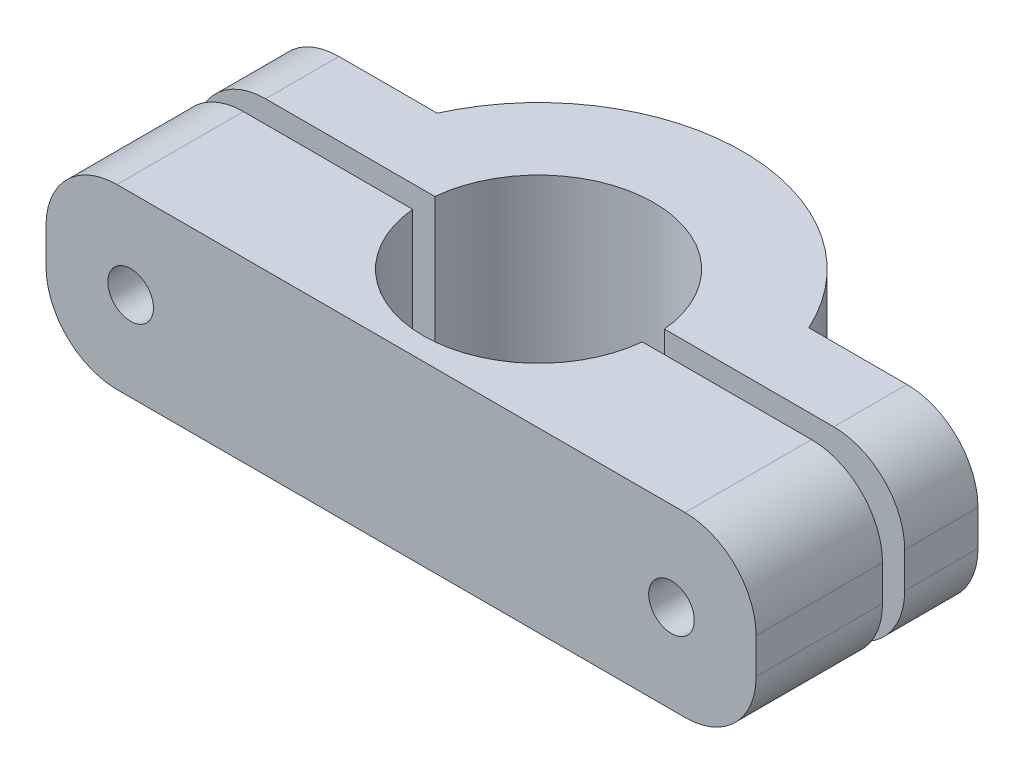
ISO-10303-21;
HEADER;
FILE_DESCRIPTION(('STEP AP214'),'2;1');
FILE_NAME('part.step','',(''),(''),'','','');
FILE_SCHEMA(('AUTOMOTIVE_DESIGN { 1 0 10303 214 1 1 1 1 }'));
ENDSEC;
DATA;
#1=APPLICATION_CONTEXT('core data for automotive mechanical design processes');
#2=APPLICATION_PROTOCOL_DEFINITION('international standard','automotive_design',2000,#1);
#3=PRODUCT_CONTEXT('',#1,'mechanical');
#4=PRODUCT('Part','Part','',(#3));
#5=PRODUCT_RELATED_PRODUCT_CATEGORY('part','',(#4));
#6=PRODUCT_DEFINITION_FORMATION('','',#4);
#7=PRODUCT_DEFINITION_CONTEXT('part definition',#1,'design');
#8=PRODUCT_DEFINITION('design','',#6,#7);
#9=PRODUCT_DEFINITION_SHAPE('','',#8);
#10=(LENGTH_UNIT() NAMED_UNIT(*) SI_UNIT(.MILLI.,.METRE.));
#11=(NAMED_UNIT(*) PLANE_ANGLE_UNIT() SI_UNIT($,.RADIAN.));
#12=(NAMED_UNIT(*) SI_UNIT($,.STERADIAN.) SOLID_ANGLE_UNIT());
#13=UNCERTAINTY_MEASURE_WITH_UNIT(LENGTH_MEASURE(1.E-05),#10,'distance_accuracy_value','');
#14=(GEOMETRIC_REPRESENTATION_CONTEXT(3) GLOBAL_UNCERTAINTY_ASSIGNED_CONTEXT((#13)) GLOBAL_UNIT_ASSIGNED_CONTEXT((#10,
#11,#12)) REPRESENTATION_CONTEXT('',''));
#15=CARTESIAN_POINT('',(0.,0.,0.));
#16=DIRECTION('',(0.,0.,1.));
#17=DIRECTION('',(1.,0.,0.));
#18=AXIS2_PLACEMENT_3D('',#15,#16,#17);
#19=CARTESIAN_POINT('',(0.,0.,-0.79375));
#20=DIRECTION('',(0.,0.,1.));
#21=DIRECTION('',(1.,0.,0.));
#22=AXIS2_PLACEMENT_3D('',#19,#20,#21);
#23=PLANE('',#22);
#24=CARTESIAN_POINT('',(-19.3465892333963,6.35,-0.793749999999999));
#25=DIRECTION('',(0.,0.,1.));
#26=DIRECTION('',(1.,0.,0.));
#27=AXIS2_PLACEMENT_3D('',#24,#25,#26);
#28=CIRCLE('',#27,1.63195);
#29=CARTESIAN_POINT('',(-17.7146392333963,6.35,-0.793749999999999));
#30=VERTEX_POINT('',#29);
#31=EDGE_CURVE('E196',#30,#30,#28,.F.);
#32=ORIENTED_EDGE('',*,*,#31,.T.);
#33=EDGE_LOOP('',(#32));
#34=FACE_BOUND('',#33,.T.);
#35=CARTESIAN_POINT('',(-20.32,5.08,-0.793749999999999));
#36=DIRECTION('',(0.,0.,1.));
#37=DIRECTION('',(1.,0.,0.));
#38=AXIS2_PLACEMENT_3D('',#35,#36,#37);
#39=CIRCLE('',#38,5.08);
#40=CARTESIAN_POINT('',(-20.32,0.,-0.793749999999999));
#41=VERTEX_POINT('',#40);
#42=CARTESIAN_POINT('',(-25.4,5.08,-0.793749999999999));
#43=VERTEX_POINT('',#42);
#44=EDGE_CURVE('E164',#41,#43,#39,.F.);
#45=ORIENTED_EDGE('',*,*,#44,.F.);
#46=DIRECTION('',(1.,0.,0.));
#47=VECTOR('',#46,1.);
#48=CARTESIAN_POINT('',(0.,0.,-0.79375));
#49=LINE('',#48,#47);
#50=CARTESIAN_POINT('',(-8.21172703744468,0.,-0.79375));
#51=VERTEX_POINT('',#50);
#52=EDGE_CURVE('E162',#41,#51,#49,.T.);
#53=ORIENTED_EDGE('',*,*,#52,.T.);
#54=DIRECTION('',(0.,-1.,0.));
#55=VECTOR('',#54,1.);
#56=CARTESIAN_POINT('',(-8.21172703744468,12.7,-0.79375));
#57=LINE('',#56,#55);
#58=CARTESIAN_POINT('',(-8.21172703744468,12.7,-0.79375));
#59=VERTEX_POINT('',#58);
#60=EDGE_CURVE('E148',#59,#51,#57,.T.);
#61=ORIENTED_EDGE('',*,*,#60,.F.);
#62=DIRECTION('',(1.,0.,0.));
#63=VECTOR('',#62,1.);
#64=CARTESIAN_POINT('',(0.,12.7,-0.79375));
#65=LINE('',#64,#63);
#66=CARTESIAN_POINT('',(-20.32,12.7,-0.793749999999999));
#67=VERTEX_POINT('',#66);
#68=EDGE_CURVE('E167',#67,#59,#65,.T.);
#69=ORIENTED_EDGE('',*,*,#68,.F.);
#70=CARTESIAN_POINT('',(-20.32,7.62,-0.79375));
#71=DIRECTION('',(0.,0.,1.));
#72=DIRECTION('',(1.,0.,0.));
#73=AXIS2_PLACEMENT_3D('',#70,#71,#72);
#74=CIRCLE('',#73,5.08);
#75=CARTESIAN_POINT('',(-25.4,7.62,-0.79375));
#76=VERTEX_POINT('',#75);
#77=EDGE_CURVE('E53',#76,#67,#74,.F.);
#78=ORIENTED_EDGE('',*,*,#77,.F.);
#79=DIRECTION('',(0.,-1.,0.));
#80=VECTOR('',#79,1.);
#81=CARTESIAN_POINT('',(-25.4,12.7,-0.793749999999999));
#82=LINE('',#81,#80);
#83=EDGE_CURVE('E199',#76,#43,#82,.T.);
#84=ORIENTED_EDGE('',*,*,#83,.T.);
#85=EDGE_LOOP('',(#45,#53,#61,#69,#78,#84));
#86=FACE_BOUND('',#85,.T.);
#87=ADVANCED_FACE('F49',(#34,#86),#23,.T.);
#88=CARTESIAN_POINT('',(19.3465892333963,6.35,-0.793749999999999));
#89=DIRECTION('',(0.,0.,1.));
#90=DIRECTION('',(1.,0.,0.));
#91=AXIS2_PLACEMENT_3D('',#88,#89,#90);
#92=CIRCLE('',#91,1.63195);
#93=CARTESIAN_POINT('',(20.9785392333963,6.35,-0.793749999999999));
#94=VERTEX_POINT('',#93);
#95=EDGE_CURVE('E200',#94,#94,#92,.F.);
#96=ORIENTED_EDGE('',*,*,#95,.T.);
#97=EDGE_LOOP('',(#96));
#98=FACE_BOUND('',#97,.T.);
#99=DIRECTION('',(0.,-1.,0.));
#100=VECTOR('',#99,1.);
#101=CARTESIAN_POINT('',(8.21172703744468,12.7,-0.79375));
#102=LINE('',#101,#100);
#103=CARTESIAN_POINT('',(8.21172703744468,0.,-0.79375));
#104=VERTEX_POINT('',#103);
#105=CARTESIAN_POINT('',(8.21172703744468,12.7,-0.79375));
#106=VERTEX_POINT('',#105);
#107=EDGE_CURVE('E158',#104,#106,#102,.F.);
#108=ORIENTED_EDGE('',*,*,#107,.F.);
#109=CARTESIAN_POINT('',(20.32,0.,-0.793749999999999));
#110=VERTEX_POINT('',#109);
#111=EDGE_CURVE('E168',#104,#110,#49,.T.);
#112=ORIENTED_EDGE('',*,*,#111,.T.);
#113=CARTESIAN_POINT('',(20.32,5.08,-0.793749999999999));
#114=DIRECTION('',(0.,0.,1.));
#115=DIRECTION('',(1.,0.,0.));
#116=AXIS2_PLACEMENT_3D('',#113,#114,#115);
#117=CIRCLE('',#116,5.08);
#118=CARTESIAN_POINT('',(25.4,5.08,-0.793749999999999));
#119=VERTEX_POINT('',#118);
#120=EDGE_CURVE('E205',#119,#110,#117,.F.);
#121=ORIENTED_EDGE('',*,*,#120,.F.);
#122=DIRECTION('',(0.,1.,0.));
#123=VECTOR('',#122,1.);
#124=CARTESIAN_POINT('',(25.4,12.7,-0.793749999999999));
#125=LINE('',#124,#123);
#126=CARTESIAN_POINT('',(25.4,7.62,-0.793749999999999));
#127=VERTEX_POINT('',#126);
#128=EDGE_CURVE('E201',#119,#127,#125,.T.);
#129=ORIENTED_EDGE('',*,*,#128,.T.);
#130=CARTESIAN_POINT('',(20.32,7.62,-0.79375));
#131=DIRECTION('',(0.,0.,1.));
#132=DIRECTION('',(1.,0.,0.));
#133=AXIS2_PLACEMENT_3D('',#130,#131,#132);
#134=CIRCLE('',#133,5.08);
#135=CARTESIAN_POINT('',(20.32,12.7,-0.79375));
#136=VERTEX_POINT('',#135);
#137=EDGE_CURVE('E179',#136,#127,#134,.F.);
#138=ORIENTED_EDGE('',*,*,#137,.F.);
#139=EDGE_CURVE('E159',#106,#136,#65,.T.);
#140=ORIENTED_EDGE('',*,*,#139,.F.);
#141=EDGE_LOOP('',(#108,#112,#121,#129,#138,#140));
#142=FACE_BOUND('',#141,.T.);
#143=ADVANCED_FACE('F254',(#98,#142),#23,.T.);
#144=CARTESIAN_POINT('',(0.,12.7,0.));
#145=DIRECTION('',(0.,-1.,0.));
#146=DIRECTION('',(0.,0.,-1.));
#147=AXIS2_PLACEMENT_3D('',#144,#145,#146);
#148=CYLINDRICAL_SURFACE('',#147,14.6);
#149=CARTESIAN_POINT('',(0.,0.,0.));
#150=DIRECTION('',(0.,1.,0.));
#151=DIRECTION('',(0.,0.,1.));
#152=AXIS2_PLACEMENT_3D('',#149,#150,#151);
#153=CIRCLE('',#152,14.6);
#154=CARTESIAN_POINT('',(13.2931784667927,0.,-6.0375));
#155=VERTEX_POINT('',#154);
#156=CARTESIAN_POINT('',(-13.2931784667927,0.,-6.03749999999999));
#157=VERTEX_POINT('',#156);
#158=EDGE_CURVE('E240',#155,#157,#153,.T.);
#159=ORIENTED_EDGE('',*,*,#158,.T.);
#160=DIRECTION('',(0.,-1.,0.));
#161=VECTOR('',#160,1.);
#162=CARTESIAN_POINT('',(-13.2931784667927,12.7,-6.03749999999999));
#163=LINE('',#162,#161);
#164=CARTESIAN_POINT('',(-13.2931784667927,12.7,-6.03749999999999));
#165=VERTEX_POINT('',#164);
#166=EDGE_CURVE('E231',#165,#157,#163,.T.);
#167=ORIENTED_EDGE('',*,*,#166,.F.);
#168=CARTESIAN_POINT('',(0.,12.7,0.));
#169=DIRECTION('',(0.,1.,0.));
#170=DIRECTION('',(0.,0.,1.));
#171=AXIS2_PLACEMENT_3D('',#168,#169,#170);
#172=CIRCLE('',#171,14.6);
#173=CARTESIAN_POINT('',(13.2931784667927,12.7,-6.0375));
#174=VERTEX_POINT('',#173);
#175=EDGE_CURVE('E80',#174,#165,#172,.T.);
#176=ORIENTED_EDGE('',*,*,#175,.F.);
#177=DIRECTION('',(0.,-1.,0.));
#178=VECTOR('',#177,1.);
#179=CARTESIAN_POINT('',(13.2931784667927,12.7,-6.0375));
#180=LINE('',#179,#178);
#181=EDGE_CURVE('E229',#174,#155,#180,.T.);
#182=ORIENTED_EDGE('',*,*,#181,.T.);
#183=EDGE_LOOP('',(#159,#167,#176,#182));
#184=FACE_BOUND('',#183,.T.);
#185=ADVANCED_FACE('F271',(#184),#148,.T.);
#186=CARTESIAN_POINT('',(-25.4,12.7,-6.03749999999999));
#187=DIRECTION('',(0.,0.,1.));
#188=DIRECTION('',(1.,0.,0.));
#189=AXIS2_PLACEMENT_3D('',#186,#187,#188);
#190=PLANE('',#189);
#191=CARTESIAN_POINT('',(-19.3465892333963,6.35,-6.03749999999999));
#192=DIRECTION('',(0.,0.,-1.));
#193=DIRECTION('',(1.,0.,0.));
#194=AXIS2_PLACEMENT_3D('',#191,#192,#193);
#195=CIRCLE('',#194,1.63195);
#196=CARTESIAN_POINT('',(-17.7146392333963,6.35,-6.03749999999999));
#197=VERTEX_POINT('',#196);
#198=EDGE_CURVE('E13',#197,#197,#195,.T.);
#199=ORIENTED_EDGE('',*,*,#198,.F.);
#200=EDGE_LOOP('',(#199));
#201=FACE_BOUND('',#200,.T.);
#202=DIRECTION('',(-1.,0.,0.));
#203=VECTOR('',#202,1.);
#204=CARTESIAN_POINT('',(-25.4,0.,-6.03749999999999));
#205=LINE('',#204,#203);
#206=CARTESIAN_POINT('',(-20.32,0.,-6.03749999999999));
#207=VERTEX_POINT('',#206);
#208=EDGE_CURVE('E237',#157,#207,#205,.T.);
#209=ORIENTED_EDGE('',*,*,#208,.T.);
#210=CARTESIAN_POINT('',(-20.32,5.08,-6.03749999999999));
#211=DIRECTION('',(0.,0.,1.));
#212=DIRECTION('',(1.,0.,0.));
#213=AXIS2_PLACEMENT_3D('',#210,#211,#212);
#214=CIRCLE('',#213,5.08);
#215=CARTESIAN_POINT('',(-25.4,5.08,-6.03749999999999));
#216=VERTEX_POINT('',#215);
#217=EDGE_CURVE('E225',#207,#216,#214,.F.);
#218=ORIENTED_EDGE('',*,*,#217,.T.);
#219=DIRECTION('',(0.,-1.,0.));
#220=VECTOR('',#219,1.);
#221=CARTESIAN_POINT('',(-25.4,12.7,-6.03749999999999));
#222=LINE('',#221,#220);
#223=CARTESIAN_POINT('',(-25.4,7.62,-6.03749999999999));
#224=VERTEX_POINT('',#223);
#225=EDGE_CURVE('E234',#224,#216,#222,.T.);
#226=ORIENTED_EDGE('',*,*,#225,.F.);
#227=CARTESIAN_POINT('',(-20.32,7.62,-6.03749999999999));
#228=DIRECTION('',(0.,0.,1.));
#229=DIRECTION('',(1.,0.,0.));
#230=AXIS2_PLACEMENT_3D('',#227,#228,#229);
#231=CIRCLE('',#230,5.08);
#232=CARTESIAN_POINT('',(-20.32,12.7,-6.03749999999999));
#233=VERTEX_POINT('',#232);
#234=EDGE_CURVE('E190',#224,#233,#231,.F.);
#235=ORIENTED_EDGE('',*,*,#234,.T.);
#236=DIRECTION('',(-1.,0.,0.));
#237=VECTOR('',#236,1.);
#238=CARTESIAN_POINT('',(-25.4,12.7,-6.03749999999999));
#239=LINE('',#238,#237);
#240=EDGE_CURVE('E236',#165,#233,#239,.T.);
#241=ORIENTED_EDGE('',*,*,#240,.F.);
#242=ORIENTED_EDGE('',*,*,#166,.T.);
#243=EDGE_LOOP('',(#209,#218,#226,#235,#241,#242));
#244=FACE_BOUND('',#243,.T.);
#245=ADVANCED_FACE('F273',(#201,#244),#190,.F.);
#246=CARTESIAN_POINT('',(0.,0.,0.));
#247=DIRECTION('',(0.,1.,0.));
#248=DIRECTION('',(0.,0.,1.));
#249=AXIS2_PLACEMENT_3D('',#246,#247,#248);
#250=PLANE('',#249);
#251=ORIENTED_EDGE('',*,*,#52,.F.);
#252=DIRECTION('',(0.,0.,1.));
#253=VECTOR('',#252,1.);
#254=CARTESIAN_POINT('',(-20.32,0.,0.));
#255=LINE('',#254,#253);
#256=EDGE_CURVE('E188',#41,#207,#255,.F.);
#257=ORIENTED_EDGE('',*,*,#256,.T.);
#258=ORIENTED_EDGE('',*,*,#208,.F.);
#259=ORIENTED_EDGE('',*,*,#158,.F.);
#260=DIRECTION('',(-1.,0.,0.));
#261=VECTOR('',#260,1.);
#262=CARTESIAN_POINT('',(25.4,0.,-6.0375));
#263=LINE('',#262,#261);
#264=CARTESIAN_POINT('',(20.32,0.,-6.0375));
#265=VERTEX_POINT('',#264);
#266=EDGE_CURVE('E68',#265,#155,#263,.T.);
#267=ORIENTED_EDGE('',*,*,#266,.F.);
#268=DIRECTION('',(0.,0.,-1.));
#269=VECTOR('',#268,1.);
#270=CARTESIAN_POINT('',(20.32,0.,0.));
#271=LINE('',#270,#269);
#272=EDGE_CURVE('E187',#265,#110,#271,.F.);
#273=ORIENTED_EDGE('',*,*,#272,.T.);
#274=ORIENTED_EDGE('',*,*,#111,.F.);
#275=CARTESIAN_POINT('',(0.,0.,0.));
#276=DIRECTION('',(0.,1.,0.));
#277=DIRECTION('',(0.,0.,1.));
#278=AXIS2_PLACEMENT_3D('',#275,#276,#277);
#279=CIRCLE('',#278,8.25);
#280=EDGE_CURVE('E152',#104,#51,#279,.T.);
#281=ORIENTED_EDGE('',*,*,#280,.T.);
#282=EDGE_LOOP('',(#251,#257,#258,#259,#267,#273,#274,#281));
#283=FACE_BOUND('',#282,.T.);
#284=ADVANCED_FACE('F171',(#283),#250,.F.);
#285=CARTESIAN_POINT('',(25.4,12.7,-6.0375));
#286=DIRECTION('',(0.,0.,1.));
#287=DIRECTION('',(1.,0.,0.));
#288=AXIS2_PLACEMENT_3D('',#285,#286,#287);
#289=PLANE('',#288);
#290=CARTESIAN_POINT('',(19.3465892333963,6.35,-6.0375));
#291=DIRECTION('',(0.,0.,-1.));
#292=DIRECTION('',(-1.,0.,0.));
#293=AXIS2_PLACEMENT_3D('',#290,#291,#292);
#294=CIRCLE('',#293,1.63195);
#295=CARTESIAN_POINT('',(17.7146392333963,6.35,-6.0375));
#296=VERTEX_POINT('',#295);
#297=EDGE_CURVE('E59',#296,#296,#294,.T.);
#298=ORIENTED_EDGE('',*,*,#297,.F.);
#299=EDGE_LOOP('',(#298));
#300=FACE_BOUND('',#299,.T.);
#301=DIRECTION('',(0.,-1.,0.));
#302=VECTOR('',#301,1.);
#303=CARTESIAN_POINT('',(25.4,12.7,-6.0375));
#304=LINE('',#303,#302);
#305=CARTESIAN_POINT('',(25.4,7.62,-6.0375));
#306=VERTEX_POINT('',#305);
#307=CARTESIAN_POINT('',(25.4,5.08,-6.0375));
#308=VERTEX_POINT('',#307);
#309=EDGE_CURVE('E183',#306,#308,#304,.T.);
#310=ORIENTED_EDGE('',*,*,#309,.T.);
#311=CARTESIAN_POINT('',(20.32,5.08,-6.0375));
#312=DIRECTION('',(0.,0.,1.));
#313=DIRECTION('',(1.,0.,0.));
#314=AXIS2_PLACEMENT_3D('',#311,#312,#313);
#315=CIRCLE('',#314,5.08);
#316=EDGE_CURVE('E213',#308,#265,#315,.F.);
#317=ORIENTED_EDGE('',*,*,#316,.T.);
#318=ORIENTED_EDGE('',*,*,#266,.T.);
#319=ORIENTED_EDGE('',*,*,#181,.F.);
#320=DIRECTION('',(-1.,0.,0.));
#321=VECTOR('',#320,1.);
#322=CARTESIAN_POINT('',(25.4,12.7,-6.0375));
#323=LINE('',#322,#321);
#324=CARTESIAN_POINT('',(20.32,12.7,-6.0375));
#325=VERTEX_POINT('',#324);
#326=EDGE_CURVE('E241',#325,#174,#323,.T.);
#327=ORIENTED_EDGE('',*,*,#326,.F.);
#328=CARTESIAN_POINT('',(20.32,7.62,-6.0375));
#329=DIRECTION('',(0.,0.,1.));
#330=DIRECTION('',(1.,0.,0.));
#331=AXIS2_PLACEMENT_3D('',#328,#329,#330);
#332=CIRCLE('',#331,5.08);
#333=EDGE_CURVE('E218',#325,#306,#332,.F.);
#334=ORIENTED_EDGE('',*,*,#333,.T.);
#335=EDGE_LOOP('',(#310,#317,#318,#319,#327,#334));
#336=FACE_BOUND('',#335,.T.);
#337=ADVANCED_FACE('F283',(#300,#336),#289,.F.);
#338=CARTESIAN_POINT('',(25.4,12.7,9.8375));
#339=DIRECTION('',(-1.,0.,0.));
#340=DIRECTION('',(0.,0.,1.));
#341=AXIS2_PLACEMENT_3D('',#338,#339,#340);
#342=PLANE('',#341);
#343=ORIENTED_EDGE('',*,*,#128,.F.);
#344=DIRECTION('',(0.,0.,-1.));
#345=VECTOR('',#344,1.);
#346=CARTESIAN_POINT('',(25.4,5.08,9.8375));
#347=LINE('',#346,#345);
#348=EDGE_CURVE('E222',#119,#308,#347,.T.);
#349=ORIENTED_EDGE('',*,*,#348,.T.);
#350=ORIENTED_EDGE('',*,*,#309,.F.);
#351=DIRECTION('',(0.,0.,-1.));
#352=VECTOR('',#351,1.);
#353=CARTESIAN_POINT('',(25.4,7.62,9.8375));
#354=LINE('',#353,#352);
#355=EDGE_CURVE('E195',#306,#127,#354,.F.);
#356=ORIENTED_EDGE('',*,*,#355,.T.);
#357=EDGE_LOOP('',(#343,#349,#350,#356));
#358=FACE_BOUND('',#357,.T.);
#359=ADVANCED_FACE('F285',(#358),#342,.F.);
#360=CARTESIAN_POINT('',(0.,12.7,0.));
#361=DIRECTION('',(0.,1.,0.));
#362=DIRECTION('',(0.,0.,1.));
#363=AXIS2_PLACEMENT_3D('',#360,#361,#362);
#364=PLANE('',#363);
#365=DIRECTION('',(0.,0.,1.));
#366=VECTOR('',#365,1.);
#367=CARTESIAN_POINT('',(-20.32,12.7,9.8375));
#368=LINE('',#367,#366);
#369=EDGE_CURVE('E191',#233,#67,#368,.T.);
#370=ORIENTED_EDGE('',*,*,#369,.T.);
#371=ORIENTED_EDGE('',*,*,#68,.T.);
#372=CARTESIAN_POINT('',(0.,12.7,0.));
#373=DIRECTION('',(0.,1.,0.));
#374=DIRECTION('',(0.,0.,1.));
#375=AXIS2_PLACEMENT_3D('',#372,#373,#374);
#376=CIRCLE('',#375,8.25);
#377=EDGE_CURVE('E154',#106,#59,#376,.T.);
#378=ORIENTED_EDGE('',*,*,#377,.F.);
#379=ORIENTED_EDGE('',*,*,#139,.T.);
#380=DIRECTION('',(0.,0.,-1.));
#381=VECTOR('',#380,1.);
#382=CARTESIAN_POINT('',(20.32,12.7,-6.0375));
#383=LINE('',#382,#381);
#384=EDGE_CURVE('E194',#136,#325,#383,.T.);
#385=ORIENTED_EDGE('',*,*,#384,.T.);
#386=ORIENTED_EDGE('',*,*,#326,.T.);
#387=ORIENTED_EDGE('',*,*,#175,.T.);
#388=ORIENTED_EDGE('',*,*,#240,.T.);
#389=EDGE_LOOP('',(#370,#371,#378,#379,#385,#386,#387,#388));
#390=FACE_BOUND('',#389,.T.);
#391=ADVANCED_FACE('F288',(#390),#364,.T.);
#392=CARTESIAN_POINT('',(20.32,7.62,0.));
#393=DIRECTION('',(0.,0.,1.));
#394=DIRECTION('',(1.,0.,0.));
#395=AXIS2_PLACEMENT_3D('',#392,#393,#394);
#396=CYLINDRICAL_SURFACE('',#395,5.08);
#397=ORIENTED_EDGE('',*,*,#384,.F.);
#398=ORIENTED_EDGE('',*,*,#137,.T.);
#399=ORIENTED_EDGE('',*,*,#355,.F.);
#400=ORIENTED_EDGE('',*,*,#333,.F.);
#401=EDGE_LOOP('',(#397,#398,#399,#400));
#402=FACE_BOUND('',#401,.T.);
#403=ADVANCED_FACE('F290',(#402),#396,.T.);
#404=CARTESIAN_POINT('',(20.32,5.08,9.8375));
#405=DIRECTION('',(0.,0.,-1.));
#406=DIRECTION('',(-1.,0.,0.));
#407=AXIS2_PLACEMENT_3D('',#404,#405,#406);
#408=CYLINDRICAL_SURFACE('',#407,5.08);
#409=ORIENTED_EDGE('',*,*,#348,.F.);
#410=ORIENTED_EDGE('',*,*,#120,.T.);
#411=ORIENTED_EDGE('',*,*,#272,.F.);
#412=ORIENTED_EDGE('',*,*,#316,.F.);
#413=EDGE_LOOP('',(#409,#410,#411,#412));
#414=FACE_BOUND('',#413,.T.);
#415=ADVANCED_FACE('F292',(#414),#408,.T.);
#416=CARTESIAN_POINT('',(-25.4,12.7,9.8375));
#417=DIRECTION('',(1.,0.,0.));
#418=DIRECTION('',(0.,0.,-1.));
#419=AXIS2_PLACEMENT_3D('',#416,#417,#418);
#420=PLANE('',#419);
#421=ORIENTED_EDGE('',*,*,#83,.F.);
#422=DIRECTION('',(0.,0.,1.));
#423=VECTOR('',#422,1.);
#424=CARTESIAN_POINT('',(-25.4,7.62,-6.03749999999999));
#425=LINE('',#424,#423);
#426=EDGE_CURVE('E88',#76,#224,#425,.F.);
#427=ORIENTED_EDGE('',*,*,#426,.T.);
#428=ORIENTED_EDGE('',*,*,#225,.T.);
#429=DIRECTION('',(0.,0.,1.));
#430=VECTOR('',#429,1.);
#431=CARTESIAN_POINT('',(-25.4,5.08,9.8375));
#432=LINE('',#431,#430);
#433=EDGE_CURVE('E184',#216,#43,#432,.T.);
#434=ORIENTED_EDGE('',*,*,#433,.T.);
#435=EDGE_LOOP('',(#421,#427,#428,#434));
#436=FACE_BOUND('',#435,.T.);
#437=ADVANCED_FACE('F294',(#436),#420,.F.);
#438=CARTESIAN_POINT('',(-20.32,7.62,0.));
#439=DIRECTION('',(0.,0.,-1.));
#440=DIRECTION('',(-1.,0.,0.));
#441=AXIS2_PLACEMENT_3D('',#438,#439,#440);
#442=CYLINDRICAL_SURFACE('',#441,5.08);
#443=ORIENTED_EDGE('',*,*,#426,.F.);
#444=ORIENTED_EDGE('',*,*,#77,.T.);
#445=ORIENTED_EDGE('',*,*,#369,.F.);
#446=ORIENTED_EDGE('',*,*,#234,.F.);
#447=EDGE_LOOP('',(#443,#444,#445,#446));
#448=FACE_BOUND('',#447,.T.);
#449=ADVANCED_FACE('F267',(#448),#442,.T.);
#450=CARTESIAN_POINT('',(-20.32,5.08,9.8375));
#451=DIRECTION('',(0.,0.,1.));
#452=DIRECTION('',(1.,0.,0.));
#453=AXIS2_PLACEMENT_3D('',#450,#451,#452);
#454=CYLINDRICAL_SURFACE('',#453,5.08);
#455=ORIENTED_EDGE('',*,*,#256,.F.);
#456=ORIENTED_EDGE('',*,*,#44,.T.);
#457=ORIENTED_EDGE('',*,*,#433,.F.);
#458=ORIENTED_EDGE('',*,*,#217,.F.);
#459=EDGE_LOOP('',(#455,#456,#457,#458));
#460=FACE_BOUND('',#459,.T.);
#461=ADVANCED_FACE('F259',(#460),#454,.T.);
#462=CARTESIAN_POINT('',(19.3465892333963,6.35,9.8375));
#463=DIRECTION('',(0.,0.,-1.));
#464=DIRECTION('',(-1.,0.,0.));
#465=AXIS2_PLACEMENT_3D('',#462,#463,#464);
#466=CYLINDRICAL_SURFACE('',#465,1.63195);
#467=ORIENTED_EDGE('',*,*,#297,.T.);
#468=EDGE_LOOP('',(#467));
#469=FACE_BOUND('',#468,.T.);
#470=ORIENTED_EDGE('',*,*,#95,.F.);
#471=EDGE_LOOP('',(#470));
#472=FACE_BOUND('',#471,.T.);
#473=ADVANCED_FACE('F257',(#469,#472),#466,.F.);
#474=CARTESIAN_POINT('',(-19.3465892333963,6.35,9.83750000000001));
#475=DIRECTION('',(0.,0.,-1.));
#476=DIRECTION('',(-1.,0.,0.));
#477=AXIS2_PLACEMENT_3D('',#474,#475,#476);
#478=CYLINDRICAL_SURFACE('',#477,1.63195);
#479=ORIENTED_EDGE('',*,*,#198,.T.);
#480=EDGE_LOOP('',(#479));
#481=FACE_BOUND('',#480,.T.);
#482=ORIENTED_EDGE('',*,*,#31,.F.);
#483=EDGE_LOOP('',(#482));
#484=FACE_BOUND('',#483,.T.);
#485=ADVANCED_FACE('F51',(#481,#484),#478,.F.);
#486=CARTESIAN_POINT('',(0.,12.7,0.));
#487=DIRECTION('',(0.,-1.,0.));
#488=DIRECTION('',(0.,0.,-1.));
#489=AXIS2_PLACEMENT_3D('',#486,#487,#488);
#490=CYLINDRICAL_SURFACE('',#489,8.25);
#491=ORIENTED_EDGE('',*,*,#377,.T.);
#492=ORIENTED_EDGE('',*,*,#60,.T.);
#493=ORIENTED_EDGE('',*,*,#280,.F.);
#494=ORIENTED_EDGE('',*,*,#107,.T.);
#495=EDGE_LOOP('',(#491,#492,#493,#494));
#496=FACE_BOUND('',#495,.T.);
#497=ADVANCED_FACE('F150',(#496),#490,.F.);
#498=CLOSED_SHELL('',(#87,#143,#185,#245,#284,#337,#359,#391,#403,#415,#437,#449,#461,#473,#485,#497));
#499=MANIFOLD_SOLID_BREP('B2',#498);
#500=CARTESIAN_POINT('',(0.,0.,0.79375));
#501=DIRECTION('',(0.,0.,1.));
#502=DIRECTION('',(1.,0.,0.));
#503=AXIS2_PLACEMENT_3D('',#500,#501,#502);
#504=PLANE('',#503);
#505=CARTESIAN_POINT('',(-20.32,5.08,0.793749999999999));
#506=DIRECTION('',(0.,0.,1.));
#507=DIRECTION('',(1.,0.,0.));
#508=AXIS2_PLACEMENT_3D('',#505,#506,#507);
#509=CIRCLE('',#508,5.08);
#510=CARTESIAN_POINT('',(-20.32,0.,0.793749999999999));
#511=VERTEX_POINT('',#510);
#512=CARTESIAN_POINT('',(-25.4,5.08,0.793749999999999));
#513=VERTEX_POINT('',#512);
#514=EDGE_CURVE('E559',#511,#513,#509,.F.);
#515=ORIENTED_EDGE('',*,*,#514,.T.);
#516=DIRECTION('',(0.,-1.,0.));
#517=VECTOR('',#516,1.);
#518=CARTESIAN_POINT('',(-25.4,12.7,0.793749999999999));
#519=LINE('',#518,#517);
#520=CARTESIAN_POINT('',(-25.4,7.62,0.79375));
#521=VERTEX_POINT('',#520);
#522=EDGE_CURVE('E549',#521,#513,#519,.T.);
#523=ORIENTED_EDGE('',*,*,#522,.F.);
#524=CARTESIAN_POINT('',(-20.32,7.62,0.79375));
#525=DIRECTION('',(0.,0.,1.));
#526=DIRECTION('',(1.,0.,0.));
#527=AXIS2_PLACEMENT_3D('',#524,#525,#526);
#528=CIRCLE('',#527,5.08);
#529=CARTESIAN_POINT('',(-20.32,12.7,0.793749999999999));
#530=VERTEX_POINT('',#529);
#531=EDGE_CURVE('E522',#521,#530,#528,.F.);
#532=ORIENTED_EDGE('',*,*,#531,.T.);
#533=DIRECTION('',(1.,0.,0.));
#534=VECTOR('',#533,1.);
#535=CARTESIAN_POINT('',(0.,12.7,0.79375));
#536=LINE('',#535,#534);
#537=CARTESIAN_POINT('',(-8.21172703744468,12.7,0.79375));
#538=VERTEX_POINT('',#537);
#539=EDGE_CURVE('E553',#530,#538,#536,.T.);
#540=ORIENTED_EDGE('',*,*,#539,.T.);
#541=DIRECTION('',(0.,-1.,0.));
#542=VECTOR('',#541,1.);
#543=CARTESIAN_POINT('',(-8.21172703744468,12.7,0.79375));
#544=LINE('',#543,#542);
#545=CARTESIAN_POINT('',(-8.21172703744468,0.,0.79375));
#546=VERTEX_POINT('',#545);
#547=EDGE_CURVE('E552',#538,#546,#544,.T.);
#548=ORIENTED_EDGE('',*,*,#547,.T.);
#549=DIRECTION('',(1.,0.,0.));
#550=VECTOR('',#549,1.);
#551=CARTESIAN_POINT('',(0.,0.,0.79375));
#552=LINE('',#551,#550);
#553=EDGE_CURVE('E560',#511,#546,#552,.T.);
#554=ORIENTED_EDGE('',*,*,#553,.F.);
#555=EDGE_LOOP('',(#515,#523,#532,#540,#548,#554));
#556=FACE_BOUND('',#555,.T.);
#557=CARTESIAN_POINT('',(-19.3465892333963,6.35,0.793749999999999));
#558=DIRECTION('',(0.,0.,1.));
#559=DIRECTION('',(1.,0.,0.));
#560=AXIS2_PLACEMENT_3D('',#557,#558,#559);
#561=CIRCLE('',#560,1.63195);
#562=CARTESIAN_POINT('',(-17.7146392333963,6.35,0.793749999999999));
#563=VERTEX_POINT('',#562);
#564=EDGE_CURVE('E423',#563,#563,#561,.F.);
#565=ORIENTED_EDGE('',*,*,#564,.F.);
#566=EDGE_LOOP('',(#565));
#567=FACE_BOUND('',#566,.T.);
#568=ADVANCED_FACE('F420',(#556,#567),#504,.F.);
#569=DIRECTION('',(0.,-1.,0.));
#570=VECTOR('',#569,1.);
#571=CARTESIAN_POINT('',(8.21172703744468,12.7,0.79375));
#572=LINE('',#571,#570);
#573=CARTESIAN_POINT('',(8.21172703744468,0.,0.79375));
#574=VERTEX_POINT('',#573);
#575=CARTESIAN_POINT('',(8.21172703744468,12.7,0.79375));
#576=VERTEX_POINT('',#575);
#577=EDGE_CURVE('E556',#574,#576,#572,.F.);
#578=ORIENTED_EDGE('',*,*,#577,.T.);
#579=CARTESIAN_POINT('',(20.32,12.7,0.79375));
#580=VERTEX_POINT('',#579);
#581=EDGE_CURVE('E550',#576,#580,#536,.T.);
#582=ORIENTED_EDGE('',*,*,#581,.T.);
#583=CARTESIAN_POINT('',(20.32,7.62,0.79375));
#584=DIRECTION('',(0.,0.,1.));
#585=DIRECTION('',(1.,0.,0.));
#586=AXIS2_PLACEMENT_3D('',#583,#584,#585);
#587=CIRCLE('',#586,5.08);
#588=CARTESIAN_POINT('',(25.4,7.62,0.793749999999999));
#589=VERTEX_POINT('',#588);
#590=EDGE_CURVE('E47',#580,#589,#587,.F.);
#591=ORIENTED_EDGE('',*,*,#590,.T.);
#592=DIRECTION('',(0.,1.,0.));
#593=VECTOR('',#592,1.);
#594=CARTESIAN_POINT('',(25.4,12.7,0.793749999999999));
#595=LINE('',#594,#593);
#596=CARTESIAN_POINT('',(25.4,5.08,0.793749999999999));
#597=VERTEX_POINT('',#596);
#598=EDGE_CURVE('E436',#597,#589,#595,.T.);
#599=ORIENTED_EDGE('',*,*,#598,.F.);
#600=CARTESIAN_POINT('',(20.32,5.08,0.793749999999999));
#601=DIRECTION('',(0.,0.,1.));
#602=DIRECTION('',(1.,0.,0.));
#603=AXIS2_PLACEMENT_3D('',#600,#601,#602);
#604=CIRCLE('',#603,5.08);
#605=CARTESIAN_POINT('',(20.32,0.,0.793749999999999));
#606=VERTEX_POINT('',#605);
#607=EDGE_CURVE('E428',#597,#606,#604,.F.);
#608=ORIENTED_EDGE('',*,*,#607,.T.);
#609=EDGE_CURVE('E548',#574,#606,#552,.T.);
#610=ORIENTED_EDGE('',*,*,#609,.F.);
#611=EDGE_LOOP('',(#578,#582,#591,#599,#608,#610));
#612=FACE_BOUND('',#611,.T.);
#613=CARTESIAN_POINT('',(19.3465892333963,6.35,0.793749999999999));
#614=DIRECTION('',(0.,0.,1.));
#615=DIRECTION('',(1.,0.,0.));
#616=AXIS2_PLACEMENT_3D('',#613,#614,#615);
#617=CIRCLE('',#616,1.63195);
#618=CARTESIAN_POINT('',(20.9785392333963,6.35,0.793749999999999));
#619=VERTEX_POINT('',#618);
#620=EDGE_CURVE('E545',#619,#619,#617,.F.);
#621=ORIENTED_EDGE('',*,*,#620,.F.);
#622=EDGE_LOOP('',(#621));
#623=FACE_BOUND('',#622,.T.);
#624=ADVANCED_FACE('F577',(#612,#623),#504,.F.);
#625=CARTESIAN_POINT('',(0.,0.,0.));
#626=DIRECTION('',(0.,1.,0.));
#627=DIRECTION('',(0.,0.,1.));
#628=AXIS2_PLACEMENT_3D('',#625,#626,#627);
#629=PLANE('',#628);
#630=DIRECTION('',(0.,0.,1.));
#631=VECTOR('',#630,1.);
#632=CARTESIAN_POINT('',(-20.32,0.,0.));
#633=LINE('',#632,#631);
#634=CARTESIAN_POINT('',(-20.32,0.,9.8375));
#635=VERTEX_POINT('',#634);
#636=EDGE_CURVE('E534',#635,#511,#633,.F.);
#637=ORIENTED_EDGE('',*,*,#636,.T.);
#638=ORIENTED_EDGE('',*,*,#553,.T.);
#639=CARTESIAN_POINT('',(0.,0.,0.));
#640=DIRECTION('',(0.,1.,0.));
#641=DIRECTION('',(0.,0.,1.));
#642=AXIS2_PLACEMENT_3D('',#639,#640,#641);
#643=CIRCLE('',#642,8.25);
#644=EDGE_CURVE('E599',#546,#574,#643,.T.);
#645=ORIENTED_EDGE('',*,*,#644,.T.);
#646=ORIENTED_EDGE('',*,*,#609,.T.);
#647=DIRECTION('',(0.,0.,-1.));
#648=VECTOR('',#647,1.);
#649=CARTESIAN_POINT('',(20.32,0.,0.));
#650=LINE('',#649,#648);
#651=CARTESIAN_POINT('',(20.32,0.,9.8375));
#652=VERTEX_POINT('',#651);
#653=EDGE_CURVE('E532',#606,#652,#650,.F.);
#654=ORIENTED_EDGE('',*,*,#653,.T.);
#655=DIRECTION('',(1.,0.,0.));
#656=VECTOR('',#655,1.);
#657=CARTESIAN_POINT('',(-25.4,0.,9.8375));
#658=LINE('',#657,#656);
#659=EDGE_CURVE('E591',#635,#652,#658,.T.);
#660=ORIENTED_EDGE('',*,*,#659,.F.);
#661=EDGE_LOOP('',(#637,#638,#645,#646,#654,#660));
#662=FACE_BOUND('',#661,.T.);
#663=ADVANCED_FACE('F582',(#662),#629,.F.);
#664=CARTESIAN_POINT('',(25.4,12.7,9.8375));
#665=DIRECTION('',(-1.,0.,0.));
#666=DIRECTION('',(0.,0.,1.));
#667=AXIS2_PLACEMENT_3D('',#664,#665,#666);
#668=PLANE('',#667);
#669=DIRECTION('',(0.,0.,-1.));
#670=VECTOR('',#669,1.);
#671=CARTESIAN_POINT('',(25.4,5.08,9.8375));
#672=LINE('',#671,#670);
#673=CARTESIAN_POINT('',(25.4,5.08,9.8375));
#674=VERTEX_POINT('',#673);
#675=EDGE_CURVE('E544',#674,#597,#672,.T.);
#676=ORIENTED_EDGE('',*,*,#675,.T.);
#677=ORIENTED_EDGE('',*,*,#598,.T.);
#678=DIRECTION('',(0.,0.,-1.));
#679=VECTOR('',#678,1.);
#680=CARTESIAN_POINT('',(25.4,7.62,9.8375));
#681=LINE('',#680,#679);
#682=CARTESIAN_POINT('',(25.4,7.62,9.8375));
#683=VERTEX_POINT('',#682);
#684=EDGE_CURVE('E542',#589,#683,#681,.F.);
#685=ORIENTED_EDGE('',*,*,#684,.T.);
#686=DIRECTION('',(0.,-1.,0.));
#687=VECTOR('',#686,1.);
#688=CARTESIAN_POINT('',(25.4,12.7,9.8375));
#689=LINE('',#688,#687);
#690=EDGE_CURVE('E518',#683,#674,#689,.T.);
#691=ORIENTED_EDGE('',*,*,#690,.T.);
#692=EDGE_LOOP('',(#676,#677,#685,#691));
#693=FACE_BOUND('',#692,.T.);
#694=ADVANCED_FACE('F605',(#693),#668,.F.);
#695=CARTESIAN_POINT('',(-25.4,12.7,9.8375));
#696=DIRECTION('',(0.,0.,-1.));
#697=DIRECTION('',(-1.,0.,0.));
#698=AXIS2_PLACEMENT_3D('',#695,#696,#697);
#699=PLANE('',#698);
#700=CARTESIAN_POINT('',(19.3465892333963,6.35,9.8375));
#701=DIRECTION('',(0.,0.,-1.));
#702=DIRECTION('',(-1.,0.,0.));
#703=AXIS2_PLACEMENT_3D('',#700,#701,#702);
#704=CIRCLE('',#703,1.63195);
#705=CARTESIAN_POINT('',(17.7146392333963,6.35,9.8375));
#706=VERTEX_POINT('',#705);
#707=EDGE_CURVE('E619',#706,#706,#704,.T.);
#708=ORIENTED_EDGE('',*,*,#707,.T.);
#709=EDGE_LOOP('',(#708));
#710=FACE_BOUND('',#709,.T.);
#711=CARTESIAN_POINT('',(-19.3465892333963,6.35,9.83750000000001));
#712=DIRECTION('',(0.,0.,-1.));
#713=DIRECTION('',(1.,0.,0.));
#714=AXIS2_PLACEMENT_3D('',#711,#712,#713);
#715=CIRCLE('',#714,1.63195);
#716=CARTESIAN_POINT('',(-17.7146392333963,6.35,9.83750000000001));
#717=VERTEX_POINT('',#716);
#718=EDGE_CURVE('E621',#717,#717,#715,.T.);
#719=ORIENTED_EDGE('',*,*,#718,.T.);
#720=EDGE_LOOP('',(#719));
#721=FACE_BOUND('',#720,.T.);
#722=DIRECTION('',(0.,-1.,0.));
#723=VECTOR('',#722,1.);
#724=CARTESIAN_POINT('',(-25.4,12.7,9.8375));
#725=LINE('',#724,#723);
#726=CARTESIAN_POINT('',(-25.4,7.62,9.8375));
#727=VERTEX_POINT('',#726);
#728=CARTESIAN_POINT('',(-25.4,5.08,9.8375));
#729=VERTEX_POINT('',#728);
#730=EDGE_CURVE('E502',#727,#729,#725,.T.);
#731=ORIENTED_EDGE('',*,*,#730,.T.);
#732=CARTESIAN_POINT('',(-20.32,5.08,9.8375));
#733=DIRECTION('',(0.,0.,-1.));
#734=DIRECTION('',(-1.,0.,0.));
#735=AXIS2_PLACEMENT_3D('',#732,#733,#734);
#736=CIRCLE('',#735,5.08);
#737=EDGE_CURVE('E508',#729,#635,#736,.F.);
#738=ORIENTED_EDGE('',*,*,#737,.T.);
#739=ORIENTED_EDGE('',*,*,#659,.T.);
#740=CARTESIAN_POINT('',(20.32,5.08,9.8375));
#741=DIRECTION('',(0.,0.,-1.));
#742=DIRECTION('',(-1.,0.,0.));
#743=AXIS2_PLACEMENT_3D('',#740,#741,#742);
#744=CIRCLE('',#743,5.08);
#745=EDGE_CURVE('E509',#652,#674,#744,.F.);
#746=ORIENTED_EDGE('',*,*,#745,.T.);
#747=ORIENTED_EDGE('',*,*,#690,.F.);
#748=CARTESIAN_POINT('',(20.32,7.62,9.8375));
#749=DIRECTION('',(0.,0.,-1.));
#750=DIRECTION('',(-1.,0.,0.));
#751=AXIS2_PLACEMENT_3D('',#748,#749,#750);
#752=CIRCLE('',#751,5.08);
#753=CARTESIAN_POINT('',(20.32,12.7,9.8375));
#754=VERTEX_POINT('',#753);
#755=EDGE_CURVE('E525',#683,#754,#752,.F.);
#756=ORIENTED_EDGE('',*,*,#755,.T.);
#757=DIRECTION('',(1.,0.,0.));
#758=VECTOR('',#757,1.);
#759=CARTESIAN_POINT('',(-25.4,12.7,9.8375));
#760=LINE('',#759,#758);
#761=CARTESIAN_POINT('',(-20.32,12.7,9.8375));
#762=VERTEX_POINT('',#761);
#763=EDGE_CURVE('E504',#762,#754,#760,.T.);
#764=ORIENTED_EDGE('',*,*,#763,.F.);
#765=CARTESIAN_POINT('',(-20.32,7.62,9.8375));
#766=DIRECTION('',(0.,0.,-1.));
#767=DIRECTION('',(-1.,0.,0.));
#768=AXIS2_PLACEMENT_3D('',#765,#766,#767);
#769=CIRCLE('',#768,5.08);
#770=EDGE_CURVE('E499',#762,#727,#769,.F.);
#771=ORIENTED_EDGE('',*,*,#770,.T.);
#772=EDGE_LOOP('',(#731,#738,#739,#746,#747,#756,#764,#771));
#773=FACE_BOUND('',#772,.T.);
#774=ADVANCED_FACE('F501',(#710,#721,#773),#699,.F.);
#775=CARTESIAN_POINT('',(0.,12.7,0.));
#776=DIRECTION('',(0.,1.,0.));
#777=DIRECTION('',(0.,0.,1.));
#778=AXIS2_PLACEMENT_3D('',#775,#776,#777);
#779=PLANE('',#778);
#780=ORIENTED_EDGE('',*,*,#539,.F.);
#781=DIRECTION('',(0.,0.,1.));
#782=VECTOR('',#781,1.);
#783=CARTESIAN_POINT('',(-20.32,12.7,9.8375));
#784=LINE('',#783,#782);
#785=EDGE_CURVE('E540',#530,#762,#784,.T.);
#786=ORIENTED_EDGE('',*,*,#785,.T.);
#787=ORIENTED_EDGE('',*,*,#763,.T.);
#788=DIRECTION('',(0.,0.,-1.));
#789=VECTOR('',#788,1.);
#790=CARTESIAN_POINT('',(20.32,12.7,-6.0375));
#791=LINE('',#790,#789);
#792=EDGE_CURVE('E537',#754,#580,#791,.T.);
#793=ORIENTED_EDGE('',*,*,#792,.T.);
#794=ORIENTED_EDGE('',*,*,#581,.F.);
#795=CARTESIAN_POINT('',(0.,12.7,0.));
#796=DIRECTION('',(0.,1.,0.));
#797=DIRECTION('',(0.,0.,1.));
#798=AXIS2_PLACEMENT_3D('',#795,#796,#797);
#799=CIRCLE('',#798,8.25);
#800=EDGE_CURVE('E595',#538,#576,#799,.T.);
#801=ORIENTED_EDGE('',*,*,#800,.F.);
#802=EDGE_LOOP('',(#780,#786,#787,#793,#794,#801));
#803=FACE_BOUND('',#802,.T.);
#804=ADVANCED_FACE('F612',(#803),#779,.T.);
#805=CARTESIAN_POINT('',(20.32,7.62,0.));
#806=DIRECTION('',(0.,0.,1.));
#807=DIRECTION('',(1.,0.,0.));
#808=AXIS2_PLACEMENT_3D('',#805,#806,#807);
#809=CYLINDRICAL_SURFACE('',#808,5.08);
#810=ORIENTED_EDGE('',*,*,#590,.F.);
#811=ORIENTED_EDGE('',*,*,#792,.F.);
#812=ORIENTED_EDGE('',*,*,#755,.F.);
#813=ORIENTED_EDGE('',*,*,#684,.F.);
#814=EDGE_LOOP('',(#810,#811,#812,#813));
#815=FACE_BOUND('',#814,.T.);
#816=ADVANCED_FACE('F610',(#815),#809,.T.);
#817=CARTESIAN_POINT('',(20.32,5.08,9.8375));
#818=DIRECTION('',(0.,0.,-1.));
#819=DIRECTION('',(-1.,0.,0.));
#820=AXIS2_PLACEMENT_3D('',#817,#818,#819);
#821=CYLINDRICAL_SURFACE('',#820,5.08);
#822=ORIENTED_EDGE('',*,*,#607,.F.);
#823=ORIENTED_EDGE('',*,*,#675,.F.);
#824=ORIENTED_EDGE('',*,*,#745,.F.);
#825=ORIENTED_EDGE('',*,*,#653,.F.);
#826=EDGE_LOOP('',(#822,#823,#824,#825));
#827=FACE_BOUND('',#826,.T.);
#828=ADVANCED_FACE('F608',(#827),#821,.T.);
#829=CARTESIAN_POINT('',(-25.4,12.7,9.8375));
#830=DIRECTION('',(1.,0.,0.));
#831=DIRECTION('',(0.,0.,-1.));
#832=AXIS2_PLACEMENT_3D('',#829,#830,#831);
#833=PLANE('',#832);
#834=DIRECTION('',(0.,0.,1.));
#835=VECTOR('',#834,1.);
#836=CARTESIAN_POINT('',(-25.4,7.62,-6.03749999999999));
#837=LINE('',#836,#835);
#838=EDGE_CURVE('E514',#727,#521,#837,.F.);
#839=ORIENTED_EDGE('',*,*,#838,.T.);
#840=ORIENTED_EDGE('',*,*,#522,.T.);
#841=DIRECTION('',(0.,0.,1.));
#842=VECTOR('',#841,1.);
#843=CARTESIAN_POINT('',(-25.4,5.08,9.8375));
#844=LINE('',#843,#842);
#845=EDGE_CURVE('E516',#513,#729,#844,.T.);
#846=ORIENTED_EDGE('',*,*,#845,.T.);
#847=ORIENTED_EDGE('',*,*,#730,.F.);
#848=EDGE_LOOP('',(#839,#840,#846,#847));
#849=FACE_BOUND('',#848,.T.);
#850=ADVANCED_FACE('F513',(#849),#833,.F.);
#851=CARTESIAN_POINT('',(-20.32,7.62,0.));
#852=DIRECTION('',(0.,0.,-1.));
#853=DIRECTION('',(-1.,0.,0.));
#854=AXIS2_PLACEMENT_3D('',#851,#852,#853);
#855=CYLINDRICAL_SURFACE('',#854,5.08);
#856=ORIENTED_EDGE('',*,*,#531,.F.);
#857=ORIENTED_EDGE('',*,*,#838,.F.);
#858=ORIENTED_EDGE('',*,*,#770,.F.);
#859=ORIENTED_EDGE('',*,*,#785,.F.);
#860=EDGE_LOOP('',(#856,#857,#858,#859));
#861=FACE_BOUND('',#860,.T.);
#862=ADVANCED_FACE('F520',(#861),#855,.T.);
#863=CARTESIAN_POINT('',(-20.32,5.08,9.8375));
#864=DIRECTION('',(0.,0.,1.));
#865=DIRECTION('',(1.,0.,0.));
#866=AXIS2_PLACEMENT_3D('',#863,#864,#865);
#867=CYLINDRICAL_SURFACE('',#866,5.08);
#868=ORIENTED_EDGE('',*,*,#514,.F.);
#869=ORIENTED_EDGE('',*,*,#636,.F.);
#870=ORIENTED_EDGE('',*,*,#737,.F.);
#871=ORIENTED_EDGE('',*,*,#845,.F.);
#872=EDGE_LOOP('',(#868,#869,#870,#871));
#873=FACE_BOUND('',#872,.T.);
#874=ADVANCED_FACE('F588',(#873),#867,.T.);
#875=CARTESIAN_POINT('',(19.3465892333963,6.35,9.8375));
#876=DIRECTION('',(0.,0.,-1.));
#877=DIRECTION('',(-1.,0.,0.));
#878=AXIS2_PLACEMENT_3D('',#875,#876,#877);
#879=CYLINDRICAL_SURFACE('',#878,1.63195);
#880=ORIENTED_EDGE('',*,*,#620,.T.);
#881=EDGE_LOOP('',(#880));
#882=FACE_BOUND('',#881,.T.);
#883=ORIENTED_EDGE('',*,*,#707,.F.);
#884=EDGE_LOOP('',(#883));
#885=FACE_BOUND('',#884,.T.);
#886=ADVANCED_FACE('F628',(#882,#885),#879,.F.);
#887=CARTESIAN_POINT('',(-19.3465892333963,6.35,9.83750000000001));
#888=DIRECTION('',(0.,0.,-1.));
#889=DIRECTION('',(-1.,0.,0.));
#890=AXIS2_PLACEMENT_3D('',#887,#888,#889);
#891=CYLINDRICAL_SURFACE('',#890,1.63195);
#892=ORIENTED_EDGE('',*,*,#564,.T.);
#893=EDGE_LOOP('',(#892));
#894=FACE_BOUND('',#893,.T.);
#895=ORIENTED_EDGE('',*,*,#718,.F.);
#896=EDGE_LOOP('',(#895));
#897=FACE_BOUND('',#896,.T.);
#898=ADVANCED_FACE('F573',(#894,#897),#891,.F.);
#899=CARTESIAN_POINT('',(0.,12.7,0.));
#900=DIRECTION('',(0.,-1.,0.));
#901=DIRECTION('',(0.,0.,-1.));
#902=AXIS2_PLACEMENT_3D('',#899,#900,#901);
#903=CYLINDRICAL_SURFACE('',#902,8.25);
#904=ORIENTED_EDGE('',*,*,#547,.F.);
#905=ORIENTED_EDGE('',*,*,#800,.T.);
#906=ORIENTED_EDGE('',*,*,#577,.F.);
#907=ORIENTED_EDGE('',*,*,#644,.F.);
#908=EDGE_LOOP('',(#904,#905,#906,#907));
#909=FACE_BOUND('',#908,.T.);
#910=ADVANCED_FACE('F584',(#909),#903,.F.);
#911=CLOSED_SHELL('',(#568,#624,#663,#694,#774,#804,#816,#828,#850,#862,#874,#886,#898,#910));
#912=MANIFOLD_SOLID_BREP('B7',#911);
#913=ADVANCED_BREP_SHAPE_REPRESENTATION('',(#18,#499,#912),#14);
#914=SHAPE_DEFINITION_REPRESENTATION(#9,#913);
ENDSEC;
END-ISO-10303-21;
